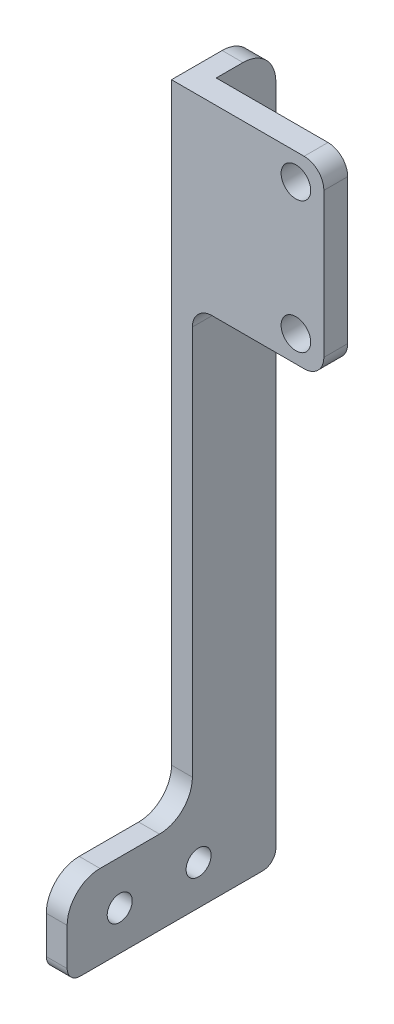
ISO-10303-21;
HEADER;
FILE_DESCRIPTION(('STEP AP214'),'2;1');
FILE_NAME('part.step','',(''),(''),'','','');
FILE_SCHEMA(('AUTOMOTIVE_DESIGN { 1 0 10303 214 1 1 1 1 }'));
ENDSEC;
DATA;
#1=APPLICATION_CONTEXT('core data for automotive mechanical design processes');
#2=APPLICATION_PROTOCOL_DEFINITION('international standard','automotive_design',2000,#1);
#3=PRODUCT_CONTEXT('',#1,'mechanical');
#4=PRODUCT('Part','Part','',(#3));
#5=PRODUCT_RELATED_PRODUCT_CATEGORY('part','',(#4));
#6=PRODUCT_DEFINITION_FORMATION('','',#4);
#7=PRODUCT_DEFINITION_CONTEXT('part definition',#1,'design');
#8=PRODUCT_DEFINITION('design','',#6,#7);
#9=PRODUCT_DEFINITION_SHAPE('','',#8);
#10=(LENGTH_UNIT() NAMED_UNIT(*) SI_UNIT(.MILLI.,.METRE.));
#11=(NAMED_UNIT(*) PLANE_ANGLE_UNIT() SI_UNIT($,.RADIAN.));
#12=(NAMED_UNIT(*) SI_UNIT($,.STERADIAN.) SOLID_ANGLE_UNIT());
#13=UNCERTAINTY_MEASURE_WITH_UNIT(LENGTH_MEASURE(1.E-05),#10,'distance_accuracy_value','');
#14=(GEOMETRIC_REPRESENTATION_CONTEXT(3) GLOBAL_UNCERTAINTY_ASSIGNED_CONTEXT((#13)) GLOBAL_UNIT_ASSIGNED_CONTEXT((#10,
#11,#12)) REPRESENTATION_CONTEXT('',''));
#15=CARTESIAN_POINT('',(0.,0.,0.));
#16=DIRECTION('',(0.,0.,1.));
#17=DIRECTION('',(1.,0.,0.));
#18=AXIS2_PLACEMENT_3D('',#15,#16,#17);
#19=CARTESIAN_POINT('',(0.,0.,0.));
#20=DIRECTION('',(-1.,0.,0.));
#21=DIRECTION('',(0.,0.,1.));
#22=AXIS2_PLACEMENT_3D('',#19,#20,#21);
#23=PLANE('',#22);
#24=CARTESIAN_POINT('',(0.,-102.005238918403,17.4056082891731));
#25=DIRECTION('',(1.,0.,0.));
#26=DIRECTION('',(0.,0.,-1.));
#27=AXIS2_PLACEMENT_3D('',#24,#25,#26);
#28=CIRCLE('',#27,1.9);
#29=CARTESIAN_POINT('',(0.,-102.005238918403,15.5056082891731));
#30=VERTEX_POINT('',#29);
#31=EDGE_CURVE('E346',#30,#30,#28,.T.);
#32=ORIENTED_EDGE('',*,*,#31,.F.);
#33=EDGE_LOOP('',(#32));
#34=FACE_BOUND('',#33,.T.);
#35=CARTESIAN_POINT('',(0.,-102.005238918403,5.40560828917308));
#36=DIRECTION('',(1.,0.,0.));
#37=DIRECTION('',(0.,0.,-1.));
#38=AXIS2_PLACEMENT_3D('',#35,#36,#37);
#39=CIRCLE('',#38,1.9);
#40=CARTESIAN_POINT('',(0.,-102.005238918403,3.50560828917308));
#41=VERTEX_POINT('',#40);
#42=EDGE_CURVE('E347',#41,#41,#39,.T.);
#43=ORIENTED_EDGE('',*,*,#42,.F.);
#44=EDGE_LOOP('',(#43));
#45=FACE_BOUND('',#44,.T.);
#46=DIRECTION('',(0.,-1.,0.));
#47=VECTOR('',#46,1.);
#48=CARTESIAN_POINT('',(0.,-108.005238918403,25.4));
#49=LINE('',#48,#47);
#50=CARTESIAN_POINT('',(0.,-100.305238918403,25.4));
#51=VERTEX_POINT('',#50);
#52=CARTESIAN_POINT('',(0.,-106.005238918403,25.4));
#53=VERTEX_POINT('',#52);
#54=EDGE_CURVE('E185',#51,#53,#49,.T.);
#55=ORIENTED_EDGE('',*,*,#54,.T.);
#56=CARTESIAN_POINT('',(0.,-106.005238918403,23.4));
#57=DIRECTION('',(-1.,0.,0.));
#58=DIRECTION('',(0.,0.,1.));
#59=AXIS2_PLACEMENT_3D('',#56,#57,#58);
#60=CIRCLE('',#59,2.);
#61=CARTESIAN_POINT('',(0.,-108.005238918403,23.4));
#62=VERTEX_POINT('',#61);
#63=EDGE_CURVE('E258',#53,#62,#60,.F.);
#64=ORIENTED_EDGE('',*,*,#63,.T.);
#65=DIRECTION('',(0.,0.,-1.));
#66=VECTOR('',#65,1.);
#67=CARTESIAN_POINT('',(0.,-108.005238918403,-6.35000000000002));
#68=LINE('',#67,#66);
#69=CARTESIAN_POINT('',(0.,-108.005238918403,-4.35000000000002));
#70=VERTEX_POINT('',#69);
#71=EDGE_CURVE('E188',#62,#70,#68,.T.);
#72=ORIENTED_EDGE('',*,*,#71,.T.);
#73=CARTESIAN_POINT('',(0.,-106.005238918403,-4.35000000000002));
#74=DIRECTION('',(-1.,0.,0.));
#75=DIRECTION('',(0.,0.,1.));
#76=AXIS2_PLACEMENT_3D('',#73,#74,#75);
#77=CIRCLE('',#76,2.);
#78=CARTESIAN_POINT('',(0.,-106.005238918403,-6.35000000000002));
#79=VERTEX_POINT('',#78);
#80=EDGE_CURVE('E256',#70,#79,#77,.F.);
#81=ORIENTED_EDGE('',*,*,#80,.T.);
#82=DIRECTION('',(0.,1.,0.));
#83=VECTOR('',#82,1.);
#84=CARTESIAN_POINT('',(0.,0.,-6.34999999999999));
#85=LINE('',#84,#83);
#86=CARTESIAN_POINT('',(0.,-5.,-6.34999999999999));
#87=VERTEX_POINT('',#86);
#88=EDGE_CURVE('E192',#79,#87,#85,.T.);
#89=ORIENTED_EDGE('',*,*,#88,.T.);
#90=CARTESIAN_POINT('',(0.,-5.,-1.34999999999999));
#91=DIRECTION('',(-1.,0.,0.));
#92=DIRECTION('',(0.,0.,1.));
#93=AXIS2_PLACEMENT_3D('',#90,#91,#92);
#94=CIRCLE('',#93,5.);
#95=CARTESIAN_POINT('',(0.,0.,-1.34999999999999));
#96=VERTEX_POINT('',#95);
#97=EDGE_CURVE('E207',#87,#96,#94,.F.);
#98=ORIENTED_EDGE('',*,*,#97,.T.);
#99=DIRECTION('',(0.,0.,1.));
#100=VECTOR('',#99,1.);
#101=CARTESIAN_POINT('',(0.,0.,6.34999999999999));
#102=LINE('',#101,#100);
#103=CARTESIAN_POINT('',(0.,0.,2.72018204231017));
#104=VERTEX_POINT('',#103);
#105=EDGE_CURVE('E194',#96,#104,#102,.T.);
#106=ORIENTED_EDGE('',*,*,#105,.T.);
#107=DIRECTION('',(0.,1.,0.));
#108=VECTOR('',#107,1.);
#109=CARTESIAN_POINT('',(0.,-28.,2.72018204231017));
#110=LINE('',#109,#108);
#111=CARTESIAN_POINT('',(0.,-31.,2.72018204231017));
#112=VERTEX_POINT('',#111);
#113=EDGE_CURVE('E304',#112,#104,#110,.T.);
#114=ORIENTED_EDGE('',*,*,#113,.F.);
#115=DIRECTION('',(0.,0.,-1.));
#116=VECTOR('',#115,1.);
#117=CARTESIAN_POINT('',(0.,-31.,6.34999999999999));
#118=LINE('',#117,#116);
#119=CARTESIAN_POINT('',(0.,-31.,6.34999999999999));
#120=VERTEX_POINT('',#119);
#121=EDGE_CURVE('E231',#112,#120,#118,.F.);
#122=ORIENTED_EDGE('',*,*,#121,.T.);
#123=DIRECTION('',(0.,-1.,0.));
#124=VECTOR('',#123,1.);
#125=CARTESIAN_POINT('',(0.,-95.3052389184033,6.34999999999999));
#126=LINE('',#125,#124);
#127=CARTESIAN_POINT('',(0.,-90.3052389184033,6.34999999999999));
#128=VERTEX_POINT('',#127);
#129=EDGE_CURVE('E197',#120,#128,#126,.T.);
#130=ORIENTED_EDGE('',*,*,#129,.T.);
#131=CARTESIAN_POINT('',(0.,-90.3052389184033,11.35));
#132=DIRECTION('',(-1.,0.,0.));
#133=DIRECTION('',(0.,0.,1.));
#134=AXIS2_PLACEMENT_3D('',#131,#132,#133);
#135=CIRCLE('',#134,5.);
#136=CARTESIAN_POINT('',(0.,-95.3052389184033,11.35));
#137=VERTEX_POINT('',#136);
#138=EDGE_CURVE('E223',#128,#137,#135,.T.);
#139=ORIENTED_EDGE('',*,*,#138,.T.);
#140=DIRECTION('',(0.,0.,1.));
#141=VECTOR('',#140,1.);
#142=CARTESIAN_POINT('',(0.,-95.3052389184033,25.4));
#143=LINE('',#142,#141);
#144=CARTESIAN_POINT('',(0.,-95.3052389184033,20.4));
#145=VERTEX_POINT('',#144);
#146=EDGE_CURVE('E199',#137,#145,#143,.T.);
#147=ORIENTED_EDGE('',*,*,#146,.T.);
#148=CARTESIAN_POINT('',(0.,-100.305238918403,20.4));
#149=DIRECTION('',(-1.,0.,0.));
#150=DIRECTION('',(0.,0.,1.));
#151=AXIS2_PLACEMENT_3D('',#148,#149,#150);
#152=CIRCLE('',#151,5.);
#153=EDGE_CURVE('E209',#145,#51,#152,.F.);
#154=ORIENTED_EDGE('',*,*,#153,.T.);
#155=EDGE_LOOP('',(#55,#64,#72,#81,#89,#98,#106,#114,#122,#130,#139,#147,#154));
#156=FACE_BOUND('',#155,.T.);
#157=ADVANCED_FACE('F33',(#34,#45,#156),#23,.F.);
#158=CARTESIAN_POINT('',(-3.175,-108.005238918403,25.4));
#159=DIRECTION('',(0.,0.,1.));
#160=DIRECTION('',(1.,0.,0.));
#161=AXIS2_PLACEMENT_3D('',#158,#159,#160);
#162=PLANE('',#161);
#163=DIRECTION('',(0.,-1.,0.));
#164=VECTOR('',#163,1.);
#165=CARTESIAN_POINT('',(-3.175,-108.005238918403,25.4));
#166=LINE('',#165,#164);
#167=CARTESIAN_POINT('',(-3.175,-100.305238918403,25.4));
#168=VERTEX_POINT('',#167);
#169=CARTESIAN_POINT('',(-3.175,-106.005238918403,25.4));
#170=VERTEX_POINT('',#169);
#171=EDGE_CURVE('E201',#168,#170,#166,.T.);
#172=ORIENTED_EDGE('',*,*,#171,.T.);
#173=DIRECTION('',(1.,0.,0.));
#174=VECTOR('',#173,1.);
#175=CARTESIAN_POINT('',(-3.175,-106.005238918403,25.4));
#176=LINE('',#175,#174);
#177=EDGE_CURVE('E253',#170,#53,#176,.T.);
#178=ORIENTED_EDGE('',*,*,#177,.T.);
#179=ORIENTED_EDGE('',*,*,#54,.F.);
#180=DIRECTION('',(1.,0.,0.));
#181=VECTOR('',#180,1.);
#182=CARTESIAN_POINT('',(-3.175,-100.305238918403,25.4));
#183=LINE('',#182,#181);
#184=EDGE_CURVE('E211',#51,#168,#183,.F.);
#185=ORIENTED_EDGE('',*,*,#184,.T.);
#186=EDGE_LOOP('',(#172,#178,#179,#185));
#187=FACE_BOUND('',#186,.T.);
#188=ADVANCED_FACE('F274',(#187),#162,.T.);
#189=CARTESIAN_POINT('',(-3.175,-95.3052389184033,25.4));
#190=DIRECTION('',(0.,1.,0.));
#191=DIRECTION('',(0.,0.,1.));
#192=AXIS2_PLACEMENT_3D('',#189,#190,#191);
#193=PLANE('',#192);
#194=DIRECTION('',(0.,0.,1.));
#195=VECTOR('',#194,1.);
#196=CARTESIAN_POINT('',(-3.175,-95.3052389184033,25.4));
#197=LINE('',#196,#195);
#198=CARTESIAN_POINT('',(-3.175,-95.3052389184033,11.35));
#199=VERTEX_POINT('',#198);
#200=CARTESIAN_POINT('',(-3.175,-95.3052389184033,20.4));
#201=VERTEX_POINT('',#200);
#202=EDGE_CURVE('E174',#199,#201,#197,.T.);
#203=ORIENTED_EDGE('',*,*,#202,.T.);
#204=DIRECTION('',(1.,0.,0.));
#205=VECTOR('',#204,1.);
#206=CARTESIAN_POINT('',(-3.175,-95.3052389184033,20.4));
#207=LINE('',#206,#205);
#208=EDGE_CURVE('E204',#201,#145,#207,.T.);
#209=ORIENTED_EDGE('',*,*,#208,.T.);
#210=ORIENTED_EDGE('',*,*,#146,.F.);
#211=DIRECTION('',(1.,0.,0.));
#212=VECTOR('',#211,1.);
#213=CARTESIAN_POINT('',(-3.175,-95.3052389184033,11.35));
#214=LINE('',#213,#212);
#215=EDGE_CURVE('E173',#137,#199,#214,.F.);
#216=ORIENTED_EDGE('',*,*,#215,.T.);
#217=EDGE_LOOP('',(#203,#209,#210,#216));
#218=FACE_BOUND('',#217,.T.);
#219=ADVANCED_FACE('F384',(#218),#193,.T.);
#220=CARTESIAN_POINT('',(-3.175,-95.3052389184033,6.34999999999999));
#221=DIRECTION('',(0.,0.,1.));
#222=DIRECTION('',(1.,0.,0.));
#223=AXIS2_PLACEMENT_3D('',#220,#221,#222);
#224=PLANE('',#223);
#225=CARTESIAN_POINT('',(15.75,-24.,6.34999999999999));
#226=DIRECTION('',(0.,0.,1.));
#227=DIRECTION('',(1.,0.,0.));
#228=AXIS2_PLACEMENT_3D('',#225,#226,#227);
#229=CIRCLE('',#228,2.25);
#230=CARTESIAN_POINT('',(18.,-24.,6.34999999999999));
#231=VERTEX_POINT('',#230);
#232=EDGE_CURVE('E329',#231,#231,#229,.F.);
#233=ORIENTED_EDGE('',*,*,#232,.T.);
#234=EDGE_LOOP('',(#233));
#235=FACE_BOUND('',#234,.T.);
#236=CARTESIAN_POINT('',(15.75,-4.,6.34999999999999));
#237=DIRECTION('',(0.,0.,1.));
#238=DIRECTION('',(1.,0.,0.));
#239=AXIS2_PLACEMENT_3D('',#236,#237,#238);
#240=CIRCLE('',#239,2.25);
#241=CARTESIAN_POINT('',(18.,-4.,6.34999999999999));
#242=VERTEX_POINT('',#241);
#243=EDGE_CURVE('E335',#242,#242,#240,.F.);
#244=ORIENTED_EDGE('',*,*,#243,.T.);
#245=EDGE_LOOP('',(#244));
#246=FACE_BOUND('',#245,.T.);
#247=DIRECTION('',(0.,-1.,0.));
#248=VECTOR('',#247,1.);
#249=CARTESIAN_POINT('',(20.,0.,6.34999999999999));
#250=LINE('',#249,#248);
#251=CARTESIAN_POINT('',(20.,-3.,6.34999999999999));
#252=VERTEX_POINT('',#251);
#253=CARTESIAN_POINT('',(20.,-25.,6.34999999999999));
#254=VERTEX_POINT('',#253);
#255=EDGE_CURVE('E301',#252,#254,#250,.T.);
#256=ORIENTED_EDGE('',*,*,#255,.F.);
#257=CARTESIAN_POINT('',(17.,-3.,6.34999999999999));
#258=DIRECTION('',(0.,0.,1.));
#259=DIRECTION('',(1.,0.,0.));
#260=AXIS2_PLACEMENT_3D('',#257,#258,#259);
#261=CIRCLE('',#260,3.);
#262=CARTESIAN_POINT('',(17.,0.,6.34999999999999));
#263=VERTEX_POINT('',#262);
#264=EDGE_CURVE('E172',#252,#263,#261,.T.);
#265=ORIENTED_EDGE('',*,*,#264,.T.);
#266=DIRECTION('',(1.,0.,0.));
#267=VECTOR('',#266,1.);
#268=CARTESIAN_POINT('',(-3.175,0.,6.34999999999999));
#269=LINE('',#268,#267);
#270=CARTESIAN_POINT('',(-3.175,0.,6.34999999999999));
#271=VERTEX_POINT('',#270);
#272=EDGE_CURVE('E155',#271,#263,#269,.T.);
#273=ORIENTED_EDGE('',*,*,#272,.F.);
#274=DIRECTION('',(0.,-1.,0.));
#275=VECTOR('',#274,1.);
#276=CARTESIAN_POINT('',(-3.175,-95.3052389184033,6.34999999999999));
#277=LINE('',#276,#275);
#278=CARTESIAN_POINT('',(-3.175,-90.3052389184033,6.34999999999999));
#279=VERTEX_POINT('',#278);
#280=EDGE_CURVE('E163',#271,#279,#277,.T.);
#281=ORIENTED_EDGE('',*,*,#280,.T.);
#282=DIRECTION('',(1.,0.,0.));
#283=VECTOR('',#282,1.);
#284=CARTESIAN_POINT('',(0.,-90.3052389184033,6.34999999999999));
#285=LINE('',#284,#283);
#286=EDGE_CURVE('E217',#279,#128,#285,.T.);
#287=ORIENTED_EDGE('',*,*,#286,.T.);
#288=ORIENTED_EDGE('',*,*,#129,.F.);
#289=CARTESIAN_POINT('',(3.,-31.,6.34999999999999));
#290=DIRECTION('',(0.,0.,1.));
#291=DIRECTION('',(1.,0.,0.));
#292=AXIS2_PLACEMENT_3D('',#289,#290,#291);
#293=CIRCLE('',#292,3.);
#294=CARTESIAN_POINT('',(3.,-28.,6.34999999999999));
#295=VERTEX_POINT('',#294);
#296=EDGE_CURVE('E251',#120,#295,#293,.F.);
#297=ORIENTED_EDGE('',*,*,#296,.T.);
#298=DIRECTION('',(-1.,0.,0.));
#299=VECTOR('',#298,1.);
#300=CARTESIAN_POINT('',(20.,-28.,6.34999999999999));
#301=LINE('',#300,#299);
#302=CARTESIAN_POINT('',(17.,-28.,6.34999999999999));
#303=VERTEX_POINT('',#302);
#304=EDGE_CURVE('E189',#303,#295,#301,.T.);
#305=ORIENTED_EDGE('',*,*,#304,.F.);
#306=CARTESIAN_POINT('',(17.,-25.,6.34999999999999));
#307=DIRECTION('',(0.,0.,1.));
#308=DIRECTION('',(1.,0.,0.));
#309=AXIS2_PLACEMENT_3D('',#306,#307,#308);
#310=CIRCLE('',#309,3.);
#311=EDGE_CURVE('E239',#303,#254,#310,.T.);
#312=ORIENTED_EDGE('',*,*,#311,.T.);
#313=EDGE_LOOP('',(#256,#265,#273,#281,#287,#288,#297,#305,#312));
#314=FACE_BOUND('',#313,.T.);
#315=ADVANCED_FACE('F169',(#235,#246,#314),#224,.T.);
#316=CARTESIAN_POINT('',(-3.175,0.,6.34999999999999));
#317=DIRECTION('',(0.,1.,0.));
#318=DIRECTION('',(0.,0.,1.));
#319=AXIS2_PLACEMENT_3D('',#316,#317,#318);
#320=PLANE('',#319);
#321=ORIENTED_EDGE('',*,*,#272,.T.);
#322=DIRECTION('',(0.,0.,1.));
#323=VECTOR('',#322,1.);
#324=CARTESIAN_POINT('',(17.,0.,6.34999999999999));
#325=LINE('',#324,#323);
#326=CARTESIAN_POINT('',(17.,0.,2.72018204231017));
#327=VERTEX_POINT('',#326);
#328=EDGE_CURVE('E242',#263,#327,#325,.F.);
#329=ORIENTED_EDGE('',*,*,#328,.T.);
#330=DIRECTION('',(-1.,0.,0.));
#331=VECTOR('',#330,1.);
#332=CARTESIAN_POINT('',(20.,0.,2.72018204231017));
#333=LINE('',#332,#331);
#334=EDGE_CURVE('E292',#327,#104,#333,.T.);
#335=ORIENTED_EDGE('',*,*,#334,.T.);
#336=ORIENTED_EDGE('',*,*,#105,.F.);
#337=DIRECTION('',(1.,0.,0.));
#338=VECTOR('',#337,1.);
#339=CARTESIAN_POINT('',(-3.175,0.,-1.34999999999999));
#340=LINE('',#339,#338);
#341=CARTESIAN_POINT('',(-3.175,0.,-1.34999999999999));
#342=VERTEX_POINT('',#341);
#343=EDGE_CURVE('E159',#96,#342,#340,.F.);
#344=ORIENTED_EDGE('',*,*,#343,.T.);
#345=DIRECTION('',(0.,0.,1.));
#346=VECTOR('',#345,1.);
#347=CARTESIAN_POINT('',(-3.175,0.,6.34999999999999));
#348=LINE('',#347,#346);
#349=EDGE_CURVE('E152',#342,#271,#348,.T.);
#350=ORIENTED_EDGE('',*,*,#349,.T.);
#351=EDGE_LOOP('',(#321,#329,#335,#336,#344,#350));
#352=FACE_BOUND('',#351,.T.);
#353=ADVANCED_FACE('F154',(#352),#320,.T.);
#354=CARTESIAN_POINT('',(-3.175,0.,-6.34999999999999));
#355=DIRECTION('',(0.,0.,-1.));
#356=DIRECTION('',(0.,1.,0.));
#357=AXIS2_PLACEMENT_3D('',#354,#355,#356);
#358=PLANE('',#357);
#359=ORIENTED_EDGE('',*,*,#88,.F.);
#360=DIRECTION('',(1.,0.,0.));
#361=VECTOR('',#360,1.);
#362=CARTESIAN_POINT('',(-3.175,-106.005238918403,-6.35000000000002));
#363=LINE('',#362,#361);
#364=CARTESIAN_POINT('',(-3.175,-106.005238918403,-6.35000000000002));
#365=VERTEX_POINT('',#364);
#366=EDGE_CURVE('E11',#79,#365,#363,.F.);
#367=ORIENTED_EDGE('',*,*,#366,.T.);
#368=DIRECTION('',(0.,1.,0.));
#369=VECTOR('',#368,1.);
#370=CARTESIAN_POINT('',(-3.175,0.,-6.34999999999999));
#371=LINE('',#370,#369);
#372=CARTESIAN_POINT('',(-3.175,-5.,-6.34999999999999));
#373=VERTEX_POINT('',#372);
#374=EDGE_CURVE('E164',#365,#373,#371,.T.);
#375=ORIENTED_EDGE('',*,*,#374,.T.);
#376=DIRECTION('',(1.,0.,0.));
#377=VECTOR('',#376,1.);
#378=CARTESIAN_POINT('',(-3.175,-5.,-6.34999999999999));
#379=LINE('',#378,#377);
#380=EDGE_CURVE('E219',#373,#87,#379,.T.);
#381=ORIENTED_EDGE('',*,*,#380,.T.);
#382=EDGE_LOOP('',(#359,#367,#375,#381));
#383=FACE_BOUND('',#382,.T.);
#384=ADVANCED_FACE('F286',(#383),#358,.T.);
#385=CARTESIAN_POINT('',(-3.175,-108.005238918403,-6.35000000000002));
#386=DIRECTION('',(0.,-1.,0.));
#387=DIRECTION('',(0.,0.,-1.));
#388=AXIS2_PLACEMENT_3D('',#385,#386,#387);
#389=PLANE('',#388);
#390=ORIENTED_EDGE('',*,*,#71,.F.);
#391=DIRECTION('',(1.,0.,0.));
#392=VECTOR('',#391,1.);
#393=CARTESIAN_POINT('',(-3.175,-108.005238918403,23.4));
#394=LINE('',#393,#392);
#395=CARTESIAN_POINT('',(-3.175,-108.005238918403,23.4));
#396=VERTEX_POINT('',#395);
#397=EDGE_CURVE('E263',#62,#396,#394,.F.);
#398=ORIENTED_EDGE('',*,*,#397,.T.);
#399=DIRECTION('',(0.,0.,-1.));
#400=VECTOR('',#399,1.);
#401=CARTESIAN_POINT('',(-3.175,-108.005238918403,-6.35000000000002));
#402=LINE('',#401,#400);
#403=CARTESIAN_POINT('',(-3.175,-108.005238918403,-4.35000000000002));
#404=VERTEX_POINT('',#403);
#405=EDGE_CURVE('E269',#396,#404,#402,.T.);
#406=ORIENTED_EDGE('',*,*,#405,.T.);
#407=DIRECTION('',(1.,0.,0.));
#408=VECTOR('',#407,1.);
#409=CARTESIAN_POINT('',(-3.175,-108.005238918403,-4.35000000000002));
#410=LINE('',#409,#408);
#411=EDGE_CURVE('E260',#404,#70,#410,.T.);
#412=ORIENTED_EDGE('',*,*,#411,.T.);
#413=EDGE_LOOP('',(#390,#398,#406,#412));
#414=FACE_BOUND('',#413,.T.);
#415=ADVANCED_FACE('F282',(#414),#389,.T.);
#416=CARTESIAN_POINT('',(-3.175,0.,0.));
#417=DIRECTION('',(-1.,0.,0.));
#418=DIRECTION('',(0.,0.,1.));
#419=AXIS2_PLACEMENT_3D('',#416,#417,#418);
#420=PLANE('',#419);
#421=CARTESIAN_POINT('',(-3.175,-102.005238918403,17.4056082891731));
#422=DIRECTION('',(-1.,0.,0.));
#423=DIRECTION('',(0.,0.,1.));
#424=AXIS2_PLACEMENT_3D('',#421,#422,#423);
#425=CIRCLE('',#424,1.9);
#426=CARTESIAN_POINT('',(-3.175,-102.005238918403,19.3056082891731));
#427=VERTEX_POINT('',#426);
#428=EDGE_CURVE('E338',#427,#427,#425,.F.);
#429=ORIENTED_EDGE('',*,*,#428,.T.);
#430=EDGE_LOOP('',(#429));
#431=FACE_BOUND('',#430,.T.);
#432=CARTESIAN_POINT('',(-3.175,-102.005238918403,5.40560828917308));
#433=DIRECTION('',(-1.,0.,0.));
#434=DIRECTION('',(0.,0.,1.));
#435=AXIS2_PLACEMENT_3D('',#432,#433,#434);
#436=CIRCLE('',#435,1.9);
#437=CARTESIAN_POINT('',(-3.175,-102.005238918403,7.30560828917308));
#438=VERTEX_POINT('',#437);
#439=EDGE_CURVE('E343',#438,#438,#436,.F.);
#440=ORIENTED_EDGE('',*,*,#439,.T.);
#441=EDGE_LOOP('',(#440));
#442=FACE_BOUND('',#441,.T.);
#443=ORIENTED_EDGE('',*,*,#405,.F.);
#444=CARTESIAN_POINT('',(-3.175,-106.005238918403,23.4));
#445=DIRECTION('',(-1.,0.,0.));
#446=DIRECTION('',(0.,0.,1.));
#447=AXIS2_PLACEMENT_3D('',#444,#445,#446);
#448=CIRCLE('',#447,2.);
#449=EDGE_CURVE('E41',#396,#170,#448,.T.);
#450=ORIENTED_EDGE('',*,*,#449,.T.);
#451=ORIENTED_EDGE('',*,*,#171,.F.);
#452=CARTESIAN_POINT('',(-3.175,-100.305238918403,20.4));
#453=DIRECTION('',(-1.,0.,0.));
#454=DIRECTION('',(0.,0.,1.));
#455=AXIS2_PLACEMENT_3D('',#452,#453,#454);
#456=CIRCLE('',#455,5.);
#457=EDGE_CURVE('E215',#168,#201,#456,.T.);
#458=ORIENTED_EDGE('',*,*,#457,.T.);
#459=ORIENTED_EDGE('',*,*,#202,.F.);
#460=CARTESIAN_POINT('',(-3.175,-90.3052389184033,11.35));
#461=DIRECTION('',(-1.,0.,0.));
#462=DIRECTION('',(0.,0.,1.));
#463=AXIS2_PLACEMENT_3D('',#460,#461,#462);
#464=CIRCLE('',#463,5.);
#465=EDGE_CURVE('E179',#199,#279,#464,.F.);
#466=ORIENTED_EDGE('',*,*,#465,.T.);
#467=ORIENTED_EDGE('',*,*,#280,.F.);
#468=ORIENTED_EDGE('',*,*,#349,.F.);
#469=CARTESIAN_POINT('',(-3.175,-5.,-1.34999999999999));
#470=DIRECTION('',(-1.,0.,0.));
#471=DIRECTION('',(0.,0.,1.));
#472=AXIS2_PLACEMENT_3D('',#469,#470,#471);
#473=CIRCLE('',#472,5.);
#474=EDGE_CURVE('E213',#342,#373,#473,.T.);
#475=ORIENTED_EDGE('',*,*,#474,.T.);
#476=ORIENTED_EDGE('',*,*,#374,.F.);
#477=CARTESIAN_POINT('',(-3.175,-106.005238918403,-4.35000000000002));
#478=DIRECTION('',(-1.,0.,0.));
#479=DIRECTION('',(0.,0.,1.));
#480=AXIS2_PLACEMENT_3D('',#477,#478,#479);
#481=CIRCLE('',#480,2.);
#482=EDGE_CURVE('E53',#365,#404,#481,.T.);
#483=ORIENTED_EDGE('',*,*,#482,.T.);
#484=EDGE_LOOP('',(#443,#450,#451,#458,#459,#466,#467,#468,#475,#476,#483));
#485=FACE_BOUND('',#484,.T.);
#486=ADVANCED_FACE('F176',(#431,#442,#485),#420,.T.);
#487=CARTESIAN_POINT('',(-3.175,-100.305238918403,20.4));
#488=DIRECTION('',(1.,0.,0.));
#489=DIRECTION('',(0.,0.,-1.));
#490=AXIS2_PLACEMENT_3D('',#487,#488,#489);
#491=CYLINDRICAL_SURFACE('',#490,5.);
#492=ORIENTED_EDGE('',*,*,#457,.F.);
#493=ORIENTED_EDGE('',*,*,#184,.F.);
#494=ORIENTED_EDGE('',*,*,#153,.F.);
#495=ORIENTED_EDGE('',*,*,#208,.F.);
#496=EDGE_LOOP('',(#492,#493,#494,#495));
#497=FACE_BOUND('',#496,.T.);
#498=ADVANCED_FACE('F370',(#497),#491,.T.);
#499=CARTESIAN_POINT('',(-3.175,-90.3052389184033,11.35));
#500=DIRECTION('',(-1.,0.,0.));
#501=DIRECTION('',(0.,0.,1.));
#502=AXIS2_PLACEMENT_3D('',#499,#500,#501);
#503=CYLINDRICAL_SURFACE('',#502,5.);
#504=ORIENTED_EDGE('',*,*,#465,.F.);
#505=ORIENTED_EDGE('',*,*,#215,.F.);
#506=ORIENTED_EDGE('',*,*,#138,.F.);
#507=ORIENTED_EDGE('',*,*,#286,.F.);
#508=EDGE_LOOP('',(#504,#505,#506,#507));
#509=FACE_BOUND('',#508,.T.);
#510=ADVANCED_FACE('F377',(#509),#503,.F.);
#511=CARTESIAN_POINT('',(-3.175,-5.,-1.34999999999999));
#512=DIRECTION('',(1.,0.,0.));
#513=DIRECTION('',(0.,0.,-1.));
#514=AXIS2_PLACEMENT_3D('',#511,#512,#513);
#515=CYLINDRICAL_SURFACE('',#514,5.);
#516=ORIENTED_EDGE('',*,*,#474,.F.);
#517=ORIENTED_EDGE('',*,*,#343,.F.);
#518=ORIENTED_EDGE('',*,*,#97,.F.);
#519=ORIENTED_EDGE('',*,*,#380,.F.);
#520=EDGE_LOOP('',(#516,#517,#518,#519));
#521=FACE_BOUND('',#520,.T.);
#522=ADVANCED_FACE('F289',(#521),#515,.T.);
#523=CARTESIAN_POINT('',(20.,-28.,6.34999999999999));
#524=DIRECTION('',(0.,1.,0.));
#525=DIRECTION('',(0.,0.,1.));
#526=AXIS2_PLACEMENT_3D('',#523,#524,#525);
#527=PLANE('',#526);
#528=ORIENTED_EDGE('',*,*,#304,.T.);
#529=DIRECTION('',(0.,0.,-1.));
#530=VECTOR('',#529,1.);
#531=CARTESIAN_POINT('',(3.,-28.,2.72018204231017));
#532=LINE('',#531,#530);
#533=CARTESIAN_POINT('',(3.,-28.,2.72018204231017));
#534=VERTEX_POINT('',#533);
#535=EDGE_CURVE('E228',#295,#534,#532,.T.);
#536=ORIENTED_EDGE('',*,*,#535,.T.);
#537=DIRECTION('',(-1.,0.,0.));
#538=VECTOR('',#537,1.);
#539=CARTESIAN_POINT('',(20.,-28.,2.72018204231017));
#540=LINE('',#539,#538);
#541=CARTESIAN_POINT('',(17.,-28.,2.72018204231017));
#542=VERTEX_POINT('',#541);
#543=EDGE_CURVE('E295',#542,#534,#540,.T.);
#544=ORIENTED_EDGE('',*,*,#543,.F.);
#545=DIRECTION('',(0.,0.,-1.));
#546=VECTOR('',#545,1.);
#547=CARTESIAN_POINT('',(17.,-28.,6.34999999999999));
#548=LINE('',#547,#546);
#549=EDGE_CURVE('E226',#542,#303,#548,.F.);
#550=ORIENTED_EDGE('',*,*,#549,.T.);
#551=EDGE_LOOP('',(#528,#536,#544,#550));
#552=FACE_BOUND('',#551,.T.);
#553=ADVANCED_FACE('F311',(#552),#527,.F.);
#554=CARTESIAN_POINT('',(20.,-28.,2.72018204231017));
#555=DIRECTION('',(0.,0.,1.));
#556=DIRECTION('',(1.,0.,0.));
#557=AXIS2_PLACEMENT_3D('',#554,#555,#556);
#558=PLANE('',#557);
#559=CARTESIAN_POINT('',(15.75,-24.,2.72018204231017));
#560=DIRECTION('',(0.,0.,-1.));
#561=DIRECTION('',(-1.,0.,0.));
#562=AXIS2_PLACEMENT_3D('',#559,#560,#561);
#563=CIRCLE('',#562,2.25);
#564=CARTESIAN_POINT('',(13.5,-24.,2.72018204231017));
#565=VERTEX_POINT('',#564);
#566=EDGE_CURVE('E334',#565,#565,#563,.T.);
#567=ORIENTED_EDGE('',*,*,#566,.F.);
#568=EDGE_LOOP('',(#567));
#569=FACE_BOUND('',#568,.T.);
#570=CARTESIAN_POINT('',(15.75,-4.,2.72018204231017));
#571=DIRECTION('',(0.,0.,-1.));
#572=DIRECTION('',(-1.,0.,0.));
#573=AXIS2_PLACEMENT_3D('',#570,#571,#572);
#574=CIRCLE('',#573,2.25);
#575=CARTESIAN_POINT('',(13.5,-4.,2.72018204231017));
#576=VERTEX_POINT('',#575);
#577=EDGE_CURVE('E331',#576,#576,#574,.T.);
#578=ORIENTED_EDGE('',*,*,#577,.F.);
#579=EDGE_LOOP('',(#578));
#580=FACE_BOUND('',#579,.T.);
#581=ORIENTED_EDGE('',*,*,#334,.F.);
#582=CARTESIAN_POINT('',(17.,-3.,2.72018204231017));
#583=DIRECTION('',(0.,0.,1.));
#584=DIRECTION('',(1.,0.,0.));
#585=AXIS2_PLACEMENT_3D('',#582,#583,#584);
#586=CIRCLE('',#585,3.);
#587=CARTESIAN_POINT('',(20.,-3.,2.72018204231017));
#588=VERTEX_POINT('',#587);
#589=EDGE_CURVE('E246',#327,#588,#586,.F.);
#590=ORIENTED_EDGE('',*,*,#589,.T.);
#591=DIRECTION('',(0.,1.,0.));
#592=VECTOR('',#591,1.);
#593=CARTESIAN_POINT('',(20.,-28.,2.72018204231017));
#594=LINE('',#593,#592);
#595=CARTESIAN_POINT('',(20.,-25.,2.72018204231017));
#596=VERTEX_POINT('',#595);
#597=EDGE_CURVE('E296',#596,#588,#594,.T.);
#598=ORIENTED_EDGE('',*,*,#597,.F.);
#599=CARTESIAN_POINT('',(17.,-25.,2.72018204231017));
#600=DIRECTION('',(0.,0.,1.));
#601=DIRECTION('',(1.,0.,0.));
#602=AXIS2_PLACEMENT_3D('',#599,#600,#601);
#603=CIRCLE('',#602,3.);
#604=EDGE_CURVE('E244',#596,#542,#603,.F.);
#605=ORIENTED_EDGE('',*,*,#604,.T.);
#606=ORIENTED_EDGE('',*,*,#543,.T.);
#607=CARTESIAN_POINT('',(3.,-31.,2.72018204231017));
#608=DIRECTION('',(0.,0.,1.));
#609=DIRECTION('',(1.,0.,0.));
#610=AXIS2_PLACEMENT_3D('',#607,#608,#609);
#611=CIRCLE('',#610,3.);
#612=EDGE_CURVE('E248',#534,#112,#611,.T.);
#613=ORIENTED_EDGE('',*,*,#612,.T.);
#614=ORIENTED_EDGE('',*,*,#113,.T.);
#615=EDGE_LOOP('',(#581,#590,#598,#605,#606,#613,#614));
#616=FACE_BOUND('',#615,.T.);
#617=ADVANCED_FACE('F319',(#569,#580,#616),#558,.F.);
#618=CARTESIAN_POINT('',(20.,0.,0.));
#619=DIRECTION('',(1.,0.,0.));
#620=DIRECTION('',(0.,0.,-1.));
#621=AXIS2_PLACEMENT_3D('',#618,#619,#620);
#622=PLANE('',#621);
#623=ORIENTED_EDGE('',*,*,#597,.T.);
#624=DIRECTION('',(0.,0.,1.));
#625=VECTOR('',#624,1.);
#626=CARTESIAN_POINT('',(20.,-3.,0.));
#627=LINE('',#626,#625);
#628=EDGE_CURVE('E236',#588,#252,#627,.T.);
#629=ORIENTED_EDGE('',*,*,#628,.T.);
#630=ORIENTED_EDGE('',*,*,#255,.T.);
#631=DIRECTION('',(0.,0.,-1.));
#632=VECTOR('',#631,1.);
#633=CARTESIAN_POINT('',(20.,-25.,2.72018204231017));
#634=LINE('',#633,#632);
#635=EDGE_CURVE('E233',#254,#596,#634,.T.);
#636=ORIENTED_EDGE('',*,*,#635,.T.);
#637=EDGE_LOOP('',(#623,#629,#630,#636));
#638=FACE_BOUND('',#637,.T.);
#639=ADVANCED_FACE('F326',(#638),#622,.T.);
#640=CARTESIAN_POINT('',(15.75,-4.,12.7139610306789));
#641=DIRECTION('',(0.,0.,-1.));
#642=DIRECTION('',(-1.,0.,0.));
#643=AXIS2_PLACEMENT_3D('',#640,#641,#642);
#644=CYLINDRICAL_SURFACE('',#643,2.25);
#645=ORIENTED_EDGE('',*,*,#577,.T.);
#646=EDGE_LOOP('',(#645));
#647=FACE_BOUND('',#646,.T.);
#648=ORIENTED_EDGE('',*,*,#243,.F.);
#649=EDGE_LOOP('',(#648));
#650=FACE_BOUND('',#649,.T.);
#651=ADVANCED_FACE('F463',(#647,#650),#644,.F.);
#652=CARTESIAN_POINT('',(15.75,-24.,12.7139610306789));
#653=DIRECTION('',(0.,0.,-1.));
#654=DIRECTION('',(-1.,0.,0.));
#655=AXIS2_PLACEMENT_3D('',#652,#653,#654);
#656=CYLINDRICAL_SURFACE('',#655,2.25);
#657=ORIENTED_EDGE('',*,*,#566,.T.);
#658=EDGE_LOOP('',(#657));
#659=FACE_BOUND('',#658,.T.);
#660=ORIENTED_EDGE('',*,*,#232,.F.);
#661=EDGE_LOOP('',(#660));
#662=FACE_BOUND('',#661,.T.);
#663=ADVANCED_FACE('F405',(#659,#662),#656,.F.);
#664=CARTESIAN_POINT('',(3.,-31.,6.34999999999999));
#665=DIRECTION('',(0.,0.,1.));
#666=DIRECTION('',(1.,0.,0.));
#667=AXIS2_PLACEMENT_3D('',#664,#665,#666);
#668=CYLINDRICAL_SURFACE('',#667,3.);
#669=ORIENTED_EDGE('',*,*,#296,.F.);
#670=ORIENTED_EDGE('',*,*,#121,.F.);
#671=ORIENTED_EDGE('',*,*,#612,.F.);
#672=ORIENTED_EDGE('',*,*,#535,.F.);
#673=EDGE_LOOP('',(#669,#670,#671,#672));
#674=FACE_BOUND('',#673,.T.);
#675=ADVANCED_FACE('F317',(#674),#668,.F.);
#676=CARTESIAN_POINT('',(17.,-3.,0.));
#677=DIRECTION('',(0.,0.,1.));
#678=DIRECTION('',(0.,-1.,0.));
#679=AXIS2_PLACEMENT_3D('',#676,#677,#678);
#680=CYLINDRICAL_SURFACE('',#679,3.);
#681=ORIENTED_EDGE('',*,*,#589,.F.);
#682=ORIENTED_EDGE('',*,*,#328,.F.);
#683=ORIENTED_EDGE('',*,*,#264,.F.);
#684=ORIENTED_EDGE('',*,*,#628,.F.);
#685=EDGE_LOOP('',(#681,#682,#683,#684));
#686=FACE_BOUND('',#685,.T.);
#687=ADVANCED_FACE('F404',(#686),#680,.T.);
#688=CARTESIAN_POINT('',(17.,-25.,0.));
#689=DIRECTION('',(0.,0.,1.));
#690=DIRECTION('',(1.,0.,0.));
#691=AXIS2_PLACEMENT_3D('',#688,#689,#690);
#692=CYLINDRICAL_SURFACE('',#691,3.);
#693=ORIENTED_EDGE('',*,*,#311,.F.);
#694=ORIENTED_EDGE('',*,*,#549,.F.);
#695=ORIENTED_EDGE('',*,*,#604,.F.);
#696=ORIENTED_EDGE('',*,*,#635,.F.);
#697=EDGE_LOOP('',(#693,#694,#695,#696));
#698=FACE_BOUND('',#697,.T.);
#699=ADVANCED_FACE('F322',(#698),#692,.T.);
#700=CARTESIAN_POINT('',(-3.175,-106.005238918403,23.4));
#701=DIRECTION('',(1.,0.,0.));
#702=DIRECTION('',(0.,0.,-1.));
#703=AXIS2_PLACEMENT_3D('',#700,#701,#702);
#704=CYLINDRICAL_SURFACE('',#703,2.);
#705=ORIENTED_EDGE('',*,*,#449,.F.);
#706=ORIENTED_EDGE('',*,*,#397,.F.);
#707=ORIENTED_EDGE('',*,*,#63,.F.);
#708=ORIENTED_EDGE('',*,*,#177,.F.);
#709=EDGE_LOOP('',(#705,#706,#707,#708));
#710=FACE_BOUND('',#709,.T.);
#711=ADVANCED_FACE('F278',(#710),#704,.T.);
#712=CARTESIAN_POINT('',(-3.175,-106.005238918403,-4.35000000000002));
#713=DIRECTION('',(1.,0.,0.));
#714=DIRECTION('',(0.,0.,-1.));
#715=AXIS2_PLACEMENT_3D('',#712,#713,#714);
#716=CYLINDRICAL_SURFACE('',#715,2.);
#717=ORIENTED_EDGE('',*,*,#482,.F.);
#718=ORIENTED_EDGE('',*,*,#366,.F.);
#719=ORIENTED_EDGE('',*,*,#80,.F.);
#720=ORIENTED_EDGE('',*,*,#411,.F.);
#721=EDGE_LOOP('',(#717,#718,#719,#720));
#722=FACE_BOUND('',#721,.T.);
#723=ADVANCED_FACE('F35',(#722),#716,.T.);
#724=CARTESIAN_POINT('',(-8.54901153701776,-102.005238918403,5.40560828917308));
#725=DIRECTION('',(1.,0.,0.));
#726=DIRECTION('',(0.,0.,-1.));
#727=AXIS2_PLACEMENT_3D('',#724,#725,#726);
#728=CYLINDRICAL_SURFACE('',#727,1.9);
#729=ORIENTED_EDGE('',*,*,#42,.T.);
#730=EDGE_LOOP('',(#729));
#731=FACE_BOUND('',#730,.T.);
#732=ORIENTED_EDGE('',*,*,#439,.F.);
#733=EDGE_LOOP('',(#732));
#734=FACE_BOUND('',#733,.T.);
#735=ADVANCED_FACE('F363',(#731,#734),#728,.F.);
#736=CARTESIAN_POINT('',(-8.54901153701776,-102.005238918403,17.4056082891731));
#737=DIRECTION('',(1.,0.,0.));
#738=DIRECTION('',(0.,0.,-1.));
#739=AXIS2_PLACEMENT_3D('',#736,#737,#738);
#740=CYLINDRICAL_SURFACE('',#739,1.9);
#741=ORIENTED_EDGE('',*,*,#31,.T.);
#742=EDGE_LOOP('',(#741));
#743=FACE_BOUND('',#742,.T.);
#744=ORIENTED_EDGE('',*,*,#428,.F.);
#745=EDGE_LOOP('',(#744));
#746=FACE_BOUND('',#745,.T.);
#747=ADVANCED_FACE('F355',(#743,#746),#740,.F.);
#748=CLOSED_SHELL('',(#157,#188,#219,#315,#353,#384,#415,#486,#498,#510,#522,#553,#617,#639,
#651,#663,#675,#687,#699,#711,#723,#735,#747));
#749=MANIFOLD_SOLID_BREP('B2',#748);
#750=ADVANCED_BREP_SHAPE_REPRESENTATION('',(#18,#749),#14);
#751=SHAPE_DEFINITION_REPRESENTATION(#9,#750);
ENDSEC;
END-ISO-10303-21;
